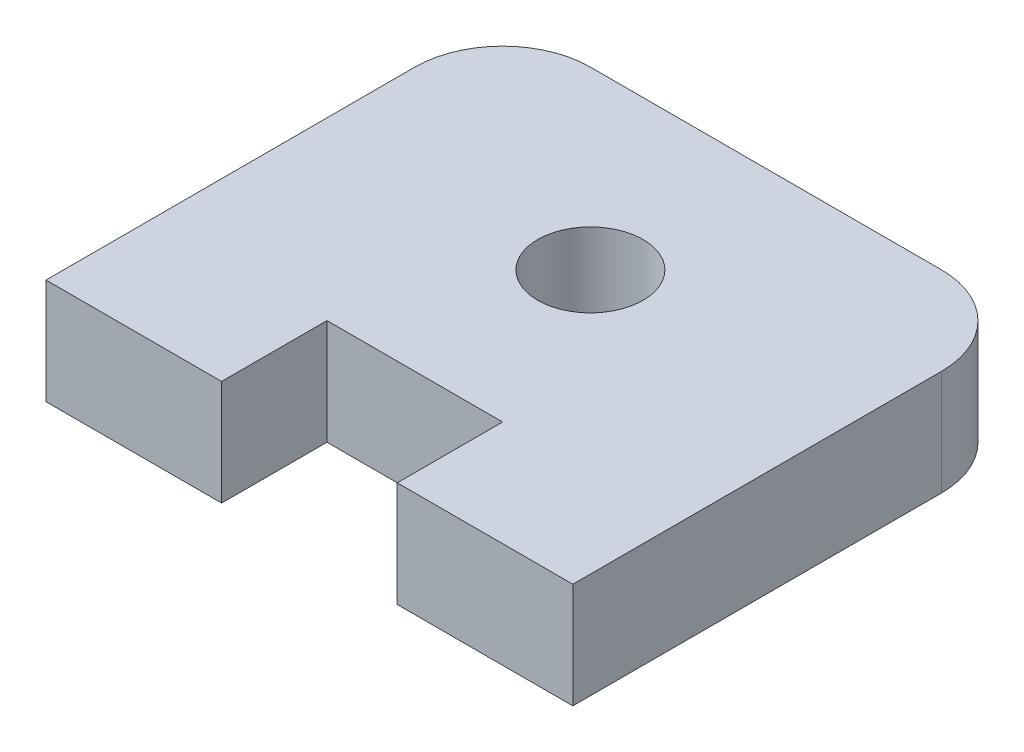
ISO-10303-21;
HEADER;
FILE_DESCRIPTION(('STEP AP214'),'2;1');
FILE_NAME('part.step','',(''),(''),'','','');
FILE_SCHEMA(('AUTOMOTIVE_DESIGN { 1 0 10303 214 1 1 1 1 }'));
ENDSEC;
DATA;
#1=APPLICATION_CONTEXT('core data for automotive mechanical design processes');
#2=APPLICATION_PROTOCOL_DEFINITION('international standard','automotive_design',2000,#1);
#3=PRODUCT_CONTEXT('',#1,'mechanical');
#4=PRODUCT('Part','Part','',(#3));
#5=PRODUCT_RELATED_PRODUCT_CATEGORY('part','',(#4));
#6=PRODUCT_DEFINITION_FORMATION('','',#4);
#7=PRODUCT_DEFINITION_CONTEXT('part definition',#1,'design');
#8=PRODUCT_DEFINITION('design','',#6,#7);
#9=PRODUCT_DEFINITION_SHAPE('','',#8);
#10=(LENGTH_UNIT() NAMED_UNIT(*) SI_UNIT(.MILLI.,.METRE.));
#11=(NAMED_UNIT(*) PLANE_ANGLE_UNIT() SI_UNIT($,.RADIAN.));
#12=(NAMED_UNIT(*) SI_UNIT($,.STERADIAN.) SOLID_ANGLE_UNIT());
#13=UNCERTAINTY_MEASURE_WITH_UNIT(LENGTH_MEASURE(1.E-05),#10,'distance_accuracy_value','');
#14=(GEOMETRIC_REPRESENTATION_CONTEXT(3) GLOBAL_UNCERTAINTY_ASSIGNED_CONTEXT((#13)) GLOBAL_UNIT_ASSIGNED_CONTEXT((#10,
#11,#12)) REPRESENTATION_CONTEXT('',''));
#15=CARTESIAN_POINT('',(0.,0.,0.));
#16=DIRECTION('',(0.,0.,1.));
#17=DIRECTION('',(1.,0.,0.));
#18=AXIS2_PLACEMENT_3D('',#15,#16,#17);
#19=CARTESIAN_POINT('',(2.5,3.,-10.5));
#20=DIRECTION('',(0.,-1.,0.));
#21=DIRECTION('',(0.,0.,-1.));
#22=AXIS2_PLACEMENT_3D('',#19,#20,#21);
#23=PLANE('',#22);
#24=DIRECTION('',(1.,0.,0.));
#25=VECTOR('',#24,1.);
#26=CARTESIAN_POINT('',(5.,3.,0.));
#27=LINE('',#26,#25);
#28=CARTESIAN_POINT('',(0.,3.,0.));
#29=VERTEX_POINT('',#28);
#30=CARTESIAN_POINT('',(5.,3.,0.));
#31=VERTEX_POINT('',#30);
#32=EDGE_CURVE('E161',#29,#31,#27,.T.);
#33=ORIENTED_EDGE('',*,*,#32,.T.);
#34=DIRECTION('',(0.,0.,-1.));
#35=VECTOR('',#34,1.);
#36=CARTESIAN_POINT('',(5.,3.,-3.));
#37=LINE('',#36,#35);
#38=CARTESIAN_POINT('',(5.,3.,-3.));
#39=VERTEX_POINT('',#38);
#40=EDGE_CURVE('E99',#31,#39,#37,.T.);
#41=ORIENTED_EDGE('',*,*,#40,.T.);
#42=DIRECTION('',(1.,0.,0.));
#43=VECTOR('',#42,1.);
#44=CARTESIAN_POINT('',(10.,3.,-3.));
#45=LINE('',#44,#43);
#46=CARTESIAN_POINT('',(10.,3.,-3.));
#47=VERTEX_POINT('',#46);
#48=EDGE_CURVE('E182',#39,#47,#45,.T.);
#49=ORIENTED_EDGE('',*,*,#48,.T.);
#50=DIRECTION('',(0.,0.,1.));
#51=VECTOR('',#50,1.);
#52=CARTESIAN_POINT('',(10.,3.,0.));
#53=LINE('',#52,#51);
#54=CARTESIAN_POINT('',(10.,3.,0.));
#55=VERTEX_POINT('',#54);
#56=EDGE_CURVE('E201',#47,#55,#53,.T.);
#57=ORIENTED_EDGE('',*,*,#56,.T.);
#58=DIRECTION('',(1.,0.,0.));
#59=VECTOR('',#58,1.);
#60=CARTESIAN_POINT('',(15.,3.,0.));
#61=LINE('',#60,#59);
#62=CARTESIAN_POINT('',(15.,3.,0.));
#63=VERTEX_POINT('',#62);
#64=EDGE_CURVE('E198',#55,#63,#61,.T.);
#65=ORIENTED_EDGE('',*,*,#64,.T.);
#66=DIRECTION('',(0.,0.,-1.));
#67=VECTOR('',#66,1.);
#68=CARTESIAN_POINT('',(15.,3.,-10.5));
#69=LINE('',#68,#67);
#70=CARTESIAN_POINT('',(15.,3.,-10.5));
#71=VERTEX_POINT('',#70);
#72=EDGE_CURVE('E200',#63,#71,#69,.T.);
#73=ORIENTED_EDGE('',*,*,#72,.T.);
#74=CARTESIAN_POINT('',(12.5,3.,-10.5));
#75=DIRECTION('',(0.,1.,0.));
#76=DIRECTION('',(0.,0.,-1.));
#77=AXIS2_PLACEMENT_3D('',#74,#75,#76);
#78=CIRCLE('',#77,2.5);
#79=CARTESIAN_POINT('',(12.5,3.,-13.));
#80=VERTEX_POINT('',#79);
#81=EDGE_CURVE('E124',#71,#80,#78,.T.);
#82=ORIENTED_EDGE('',*,*,#81,.T.);
#83=DIRECTION('',(-1.,0.,0.));
#84=VECTOR('',#83,1.);
#85=CARTESIAN_POINT('',(2.50000000000002,3.,-13.));
#86=LINE('',#85,#84);
#87=CARTESIAN_POINT('',(2.5,3.,-13.));
#88=VERTEX_POINT('',#87);
#89=EDGE_CURVE('E118',#80,#88,#86,.T.);
#90=ORIENTED_EDGE('',*,*,#89,.T.);
#91=CARTESIAN_POINT('',(2.5,3.,-10.5));
#92=DIRECTION('',(0.,1.,0.));
#93=DIRECTION('',(0.,0.,-1.));
#94=AXIS2_PLACEMENT_3D('',#91,#92,#93);
#95=CIRCLE('',#94,2.5);
#96=CARTESIAN_POINT('',(0.,3.,-10.5));
#97=VERTEX_POINT('',#96);
#98=EDGE_CURVE('E122',#88,#97,#95,.T.);
#99=ORIENTED_EDGE('',*,*,#98,.T.);
#100=DIRECTION('',(0.,0.,1.));
#101=VECTOR('',#100,1.);
#102=CARTESIAN_POINT('',(0.,3.,0.));
#103=LINE('',#102,#101);
#104=EDGE_CURVE('E50',#97,#29,#103,.T.);
#105=ORIENTED_EDGE('',*,*,#104,.T.);
#106=EDGE_LOOP('',(#33,#41,#49,#57,#65,#73,#82,#90,#99,#105));
#107=FACE_BOUND('',#106,.T.);
#108=CARTESIAN_POINT('',(7.5,3.,-8.));
#109=DIRECTION('',(0.,1.,0.));
#110=DIRECTION('',(0.,0.,1.));
#111=AXIS2_PLACEMENT_3D('',#108,#109,#110);
#112=CIRCLE('',#111,1.5);
#113=CARTESIAN_POINT('',(7.5,3.,-6.5));
#114=VERTEX_POINT('',#113);
#115=EDGE_CURVE('E146',#114,#114,#112,.T.);
#116=ORIENTED_EDGE('',*,*,#115,.F.);
#117=EDGE_LOOP('',(#116));
#118=FACE_BOUND('',#117,.T.);
#119=ADVANCED_FACE('F33',(#107,#118),#23,.F.);
#120=CARTESIAN_POINT('',(2.5,0.,-10.5));
#121=DIRECTION('',(0.,-1.,0.));
#122=DIRECTION('',(0.,0.,-1.));
#123=AXIS2_PLACEMENT_3D('',#120,#121,#122);
#124=PLANE('',#123);
#125=DIRECTION('',(1.,0.,0.));
#126=VECTOR('',#125,1.);
#127=CARTESIAN_POINT('',(5.,0.,0.));
#128=LINE('',#127,#126);
#129=CARTESIAN_POINT('',(0.,0.,0.));
#130=VERTEX_POINT('',#129);
#131=CARTESIAN_POINT('',(5.,0.,0.));
#132=VERTEX_POINT('',#131);
#133=EDGE_CURVE('E142',#130,#132,#128,.T.);
#134=ORIENTED_EDGE('',*,*,#133,.F.);
#135=DIRECTION('',(0.,0.,1.));
#136=VECTOR('',#135,1.);
#137=CARTESIAN_POINT('',(0.,0.,0.));
#138=LINE('',#137,#136);
#139=CARTESIAN_POINT('',(0.,0.,-10.5));
#140=VERTEX_POINT('',#139);
#141=EDGE_CURVE('E91',#140,#130,#138,.T.);
#142=ORIENTED_EDGE('',*,*,#141,.F.);
#143=CARTESIAN_POINT('',(2.5,0.,-10.5));
#144=DIRECTION('',(0.,1.,0.));
#145=DIRECTION('',(0.,0.,-1.));
#146=AXIS2_PLACEMENT_3D('',#143,#144,#145);
#147=CIRCLE('',#146,2.5);
#148=CARTESIAN_POINT('',(2.5,0.,-13.));
#149=VERTEX_POINT('',#148);
#150=EDGE_CURVE('E85',#149,#140,#147,.T.);
#151=ORIENTED_EDGE('',*,*,#150,.F.);
#152=DIRECTION('',(-1.,0.,0.));
#153=VECTOR('',#152,1.);
#154=CARTESIAN_POINT('',(2.50000000000002,0.,-13.));
#155=LINE('',#154,#153);
#156=CARTESIAN_POINT('',(12.5,0.,-13.));
#157=VERTEX_POINT('',#156);
#158=EDGE_CURVE('E132',#157,#149,#155,.T.);
#159=ORIENTED_EDGE('',*,*,#158,.F.);
#160=CARTESIAN_POINT('',(12.5,0.,-10.5));
#161=DIRECTION('',(0.,1.,0.));
#162=DIRECTION('',(0.,0.,-1.));
#163=AXIS2_PLACEMENT_3D('',#160,#161,#162);
#164=CIRCLE('',#163,2.5);
#165=CARTESIAN_POINT('',(15.,0.,-10.5));
#166=VERTEX_POINT('',#165);
#167=EDGE_CURVE('E156',#166,#157,#164,.T.);
#168=ORIENTED_EDGE('',*,*,#167,.F.);
#169=DIRECTION('',(0.,0.,-1.));
#170=VECTOR('',#169,1.);
#171=CARTESIAN_POINT('',(15.,0.,-10.5));
#172=LINE('',#171,#170);
#173=CARTESIAN_POINT('',(15.,0.,0.));
#174=VERTEX_POINT('',#173);
#175=EDGE_CURVE('E154',#174,#166,#172,.T.);
#176=ORIENTED_EDGE('',*,*,#175,.F.);
#177=DIRECTION('',(1.,0.,0.));
#178=VECTOR('',#177,1.);
#179=CARTESIAN_POINT('',(15.,0.,0.));
#180=LINE('',#179,#178);
#181=CARTESIAN_POINT('',(10.,0.,0.));
#182=VERTEX_POINT('',#181);
#183=EDGE_CURVE('E152',#182,#174,#180,.T.);
#184=ORIENTED_EDGE('',*,*,#183,.F.);
#185=DIRECTION('',(0.,0.,1.));
#186=VECTOR('',#185,1.);
#187=CARTESIAN_POINT('',(10.,0.,0.));
#188=LINE('',#187,#186);
#189=CARTESIAN_POINT('',(10.,0.,-3.));
#190=VERTEX_POINT('',#189);
#191=EDGE_CURVE('E150',#190,#182,#188,.T.);
#192=ORIENTED_EDGE('',*,*,#191,.F.);
#193=DIRECTION('',(1.,0.,0.));
#194=VECTOR('',#193,1.);
#195=CARTESIAN_POINT('',(10.,0.,-3.));
#196=LINE('',#195,#194);
#197=CARTESIAN_POINT('',(5.,0.,-3.));
#198=VERTEX_POINT('',#197);
#199=EDGE_CURVE('E148',#198,#190,#196,.T.);
#200=ORIENTED_EDGE('',*,*,#199,.F.);
#201=DIRECTION('',(0.,0.,-1.));
#202=VECTOR('',#201,1.);
#203=CARTESIAN_POINT('',(5.,0.,-3.));
#204=LINE('',#203,#202);
#205=EDGE_CURVE('E145',#132,#198,#204,.T.);
#206=ORIENTED_EDGE('',*,*,#205,.F.);
#207=EDGE_LOOP('',(#134,#142,#151,#159,#168,#176,#184,#192,#200,#206));
#208=FACE_BOUND('',#207,.T.);
#209=CARTESIAN_POINT('',(7.5,0.,-8.));
#210=DIRECTION('',(0.,1.,0.));
#211=DIRECTION('',(0.,0.,1.));
#212=AXIS2_PLACEMENT_3D('',#209,#210,#211);
#213=CIRCLE('',#212,1.5);
#214=CARTESIAN_POINT('',(7.5,0.,-6.5));
#215=VERTEX_POINT('',#214);
#216=EDGE_CURVE('E209',#215,#215,#213,.T.);
#217=ORIENTED_EDGE('',*,*,#216,.T.);
#218=EDGE_LOOP('',(#217));
#219=FACE_BOUND('',#218,.T.);
#220=ADVANCED_FACE('F186',(#208,#219),#124,.T.);
#221=CARTESIAN_POINT('',(5.,3.,0.));
#222=DIRECTION('',(0.,0.,-1.));
#223=DIRECTION('',(-1.,0.,0.));
#224=AXIS2_PLACEMENT_3D('',#221,#222,#223);
#225=PLANE('',#224);
#226=ORIENTED_EDGE('',*,*,#133,.T.);
#227=DIRECTION('',(0.,-1.,0.));
#228=VECTOR('',#227,1.);
#229=CARTESIAN_POINT('',(5.,3.,0.));
#230=LINE('',#229,#228);
#231=EDGE_CURVE('E11',#31,#132,#230,.T.);
#232=ORIENTED_EDGE('',*,*,#231,.F.);
#233=ORIENTED_EDGE('',*,*,#32,.F.);
#234=DIRECTION('',(0.,-1.,0.));
#235=VECTOR('',#234,1.);
#236=CARTESIAN_POINT('',(0.,3.,0.));
#237=LINE('',#236,#235);
#238=EDGE_CURVE('E138',#29,#130,#237,.T.);
#239=ORIENTED_EDGE('',*,*,#238,.T.);
#240=EDGE_LOOP('',(#226,#232,#233,#239));
#241=FACE_BOUND('',#240,.T.);
#242=ADVANCED_FACE('F35',(#241),#225,.F.);
#243=CARTESIAN_POINT('',(5.,3.,-3.));
#244=DIRECTION('',(-1.,0.,0.));
#245=DIRECTION('',(0.,0.,1.));
#246=AXIS2_PLACEMENT_3D('',#243,#244,#245);
#247=PLANE('',#246);
#248=ORIENTED_EDGE('',*,*,#205,.T.);
#249=DIRECTION('',(0.,-1.,0.));
#250=VECTOR('',#249,1.);
#251=CARTESIAN_POINT('',(5.,3.,-3.));
#252=LINE('',#251,#250);
#253=EDGE_CURVE('E42',#39,#198,#252,.T.);
#254=ORIENTED_EDGE('',*,*,#253,.F.);
#255=ORIENTED_EDGE('',*,*,#40,.F.);
#256=ORIENTED_EDGE('',*,*,#231,.T.);
#257=EDGE_LOOP('',(#248,#254,#255,#256));
#258=FACE_BOUND('',#257,.T.);
#259=ADVANCED_FACE('F245',(#258),#247,.F.);
#260=CARTESIAN_POINT('',(10.,3.,-3.));
#261=DIRECTION('',(0.,0.,-1.));
#262=DIRECTION('',(-1.,0.,0.));
#263=AXIS2_PLACEMENT_3D('',#260,#261,#262);
#264=PLANE('',#263);
#265=ORIENTED_EDGE('',*,*,#199,.T.);
#266=DIRECTION('',(0.,-1.,0.));
#267=VECTOR('',#266,1.);
#268=CARTESIAN_POINT('',(10.,3.,-3.));
#269=LINE('',#268,#267);
#270=EDGE_CURVE('E174',#47,#190,#269,.T.);
#271=ORIENTED_EDGE('',*,*,#270,.F.);
#272=ORIENTED_EDGE('',*,*,#48,.F.);
#273=ORIENTED_EDGE('',*,*,#253,.T.);
#274=EDGE_LOOP('',(#265,#271,#272,#273));
#275=FACE_BOUND('',#274,.T.);
#276=ADVANCED_FACE('F180',(#275),#264,.F.);
#277=CARTESIAN_POINT('',(10.,3.,0.));
#278=DIRECTION('',(1.,0.,0.));
#279=DIRECTION('',(0.,0.,-1.));
#280=AXIS2_PLACEMENT_3D('',#277,#278,#279);
#281=PLANE('',#280);
#282=ORIENTED_EDGE('',*,*,#191,.T.);
#283=DIRECTION('',(0.,-1.,0.));
#284=VECTOR('',#283,1.);
#285=CARTESIAN_POINT('',(10.,3.,0.));
#286=LINE('',#285,#284);
#287=EDGE_CURVE('E171',#55,#182,#286,.T.);
#288=ORIENTED_EDGE('',*,*,#287,.F.);
#289=ORIENTED_EDGE('',*,*,#56,.F.);
#290=ORIENTED_EDGE('',*,*,#270,.T.);
#291=EDGE_LOOP('',(#282,#288,#289,#290));
#292=FACE_BOUND('',#291,.T.);
#293=ADVANCED_FACE('F192',(#292),#281,.F.);
#294=CARTESIAN_POINT('',(15.,3.,0.));
#295=DIRECTION('',(0.,0.,-1.));
#296=DIRECTION('',(-1.,0.,0.));
#297=AXIS2_PLACEMENT_3D('',#294,#295,#296);
#298=PLANE('',#297);
#299=ORIENTED_EDGE('',*,*,#183,.T.);
#300=DIRECTION('',(0.,-1.,0.));
#301=VECTOR('',#300,1.);
#302=CARTESIAN_POINT('',(15.,3.,0.));
#303=LINE('',#302,#301);
#304=EDGE_CURVE('E168',#63,#174,#303,.T.);
#305=ORIENTED_EDGE('',*,*,#304,.F.);
#306=ORIENTED_EDGE('',*,*,#64,.F.);
#307=ORIENTED_EDGE('',*,*,#287,.T.);
#308=EDGE_LOOP('',(#299,#305,#306,#307));
#309=FACE_BOUND('',#308,.T.);
#310=ADVANCED_FACE('F196',(#309),#298,.F.);
#311=CARTESIAN_POINT('',(15.,3.,-10.5));
#312=DIRECTION('',(-1.,0.,0.));
#313=DIRECTION('',(0.,0.,1.));
#314=AXIS2_PLACEMENT_3D('',#311,#312,#313);
#315=PLANE('',#314);
#316=ORIENTED_EDGE('',*,*,#175,.T.);
#317=DIRECTION('',(0.,-1.,0.));
#318=VECTOR('',#317,1.);
#319=CARTESIAN_POINT('',(15.,3.,-10.5));
#320=LINE('',#319,#318);
#321=EDGE_CURVE('E165',#71,#166,#320,.T.);
#322=ORIENTED_EDGE('',*,*,#321,.F.);
#323=ORIENTED_EDGE('',*,*,#72,.F.);
#324=ORIENTED_EDGE('',*,*,#304,.T.);
#325=EDGE_LOOP('',(#316,#322,#323,#324));
#326=FACE_BOUND('',#325,.T.);
#327=ADVANCED_FACE('F235',(#326),#315,.F.);
#328=CARTESIAN_POINT('',(12.5,3.,-10.5));
#329=DIRECTION('',(0.,-1.,0.));
#330=DIRECTION('',(0.,0.,-1.));
#331=AXIS2_PLACEMENT_3D('',#328,#329,#330);
#332=CYLINDRICAL_SURFACE('',#331,2.5);
#333=ORIENTED_EDGE('',*,*,#167,.T.);
#334=DIRECTION('',(0.,-1.,0.));
#335=VECTOR('',#334,1.);
#336=CARTESIAN_POINT('',(12.5,3.,-13.));
#337=LINE('',#336,#335);
#338=EDGE_CURVE('E133',#80,#157,#337,.T.);
#339=ORIENTED_EDGE('',*,*,#338,.F.);
#340=ORIENTED_EDGE('',*,*,#81,.F.);
#341=ORIENTED_EDGE('',*,*,#321,.T.);
#342=EDGE_LOOP('',(#333,#339,#340,#341));
#343=FACE_BOUND('',#342,.T.);
#344=ADVANCED_FACE('F232',(#343),#332,.T.);
#345=CARTESIAN_POINT('',(2.50000000000002,3.,-13.));
#346=DIRECTION('',(0.,0.,1.));
#347=DIRECTION('',(1.,0.,0.));
#348=AXIS2_PLACEMENT_3D('',#345,#346,#347);
#349=PLANE('',#348);
#350=ORIENTED_EDGE('',*,*,#158,.T.);
#351=DIRECTION('',(0.,-1.,0.));
#352=VECTOR('',#351,1.);
#353=CARTESIAN_POINT('',(2.5,3.,-13.));
#354=LINE('',#353,#352);
#355=EDGE_CURVE('E129',#88,#149,#354,.T.);
#356=ORIENTED_EDGE('',*,*,#355,.F.);
#357=ORIENTED_EDGE('',*,*,#89,.F.);
#358=ORIENTED_EDGE('',*,*,#338,.T.);
#359=EDGE_LOOP('',(#350,#356,#357,#358));
#360=FACE_BOUND('',#359,.T.);
#361=ADVANCED_FACE('F130',(#360),#349,.F.);
#362=CARTESIAN_POINT('',(2.5,3.,-10.5));
#363=DIRECTION('',(0.,-1.,0.));
#364=DIRECTION('',(0.,0.,-1.));
#365=AXIS2_PLACEMENT_3D('',#362,#363,#364);
#366=CYLINDRICAL_SURFACE('',#365,2.5);
#367=ORIENTED_EDGE('',*,*,#150,.T.);
#368=DIRECTION('',(0.,-1.,0.));
#369=VECTOR('',#368,1.);
#370=CARTESIAN_POINT('',(0.,3.,-10.5));
#371=LINE('',#370,#369);
#372=EDGE_CURVE('E134',#97,#140,#371,.T.);
#373=ORIENTED_EDGE('',*,*,#372,.F.);
#374=ORIENTED_EDGE('',*,*,#98,.F.);
#375=ORIENTED_EDGE('',*,*,#355,.T.);
#376=EDGE_LOOP('',(#367,#373,#374,#375));
#377=FACE_BOUND('',#376,.T.);
#378=ADVANCED_FACE('F136',(#377),#366,.T.);
#379=CARTESIAN_POINT('',(0.,3.,0.));
#380=DIRECTION('',(1.,0.,0.));
#381=DIRECTION('',(0.,0.,-1.));
#382=AXIS2_PLACEMENT_3D('',#379,#380,#381);
#383=PLANE('',#382);
#384=ORIENTED_EDGE('',*,*,#141,.T.);
#385=ORIENTED_EDGE('',*,*,#238,.F.);
#386=ORIENTED_EDGE('',*,*,#104,.F.);
#387=ORIENTED_EDGE('',*,*,#372,.T.);
#388=EDGE_LOOP('',(#384,#385,#386,#387));
#389=FACE_BOUND('',#388,.T.);
#390=ADVANCED_FACE('F225',(#389),#383,.F.);
#391=CARTESIAN_POINT('',(7.5,3.,-8.));
#392=DIRECTION('',(0.,-1.,0.));
#393=DIRECTION('',(0.,0.,-1.));
#394=AXIS2_PLACEMENT_3D('',#391,#392,#393);
#395=CYLINDRICAL_SURFACE('',#394,1.5);
#396=ORIENTED_EDGE('',*,*,#115,.T.);
#397=EDGE_LOOP('',(#396));
#398=FACE_BOUND('',#397,.T.);
#399=ORIENTED_EDGE('',*,*,#216,.F.);
#400=EDGE_LOOP('',(#399));
#401=FACE_BOUND('',#400,.T.);
#402=ADVANCED_FACE('F215',(#398,#401),#395,.F.);
#403=CLOSED_SHELL('',(#119,#220,#242,#259,#276,#293,#310,#327,#344,#361,#378,#390,#402));
#404=MANIFOLD_SOLID_BREP('B2',#403);
#405=ADVANCED_BREP_SHAPE_REPRESENTATION('',(#18,#404),#14);
#406=SHAPE_DEFINITION_REPRESENTATION(#9,#405);
ENDSEC;
END-ISO-10303-21;
